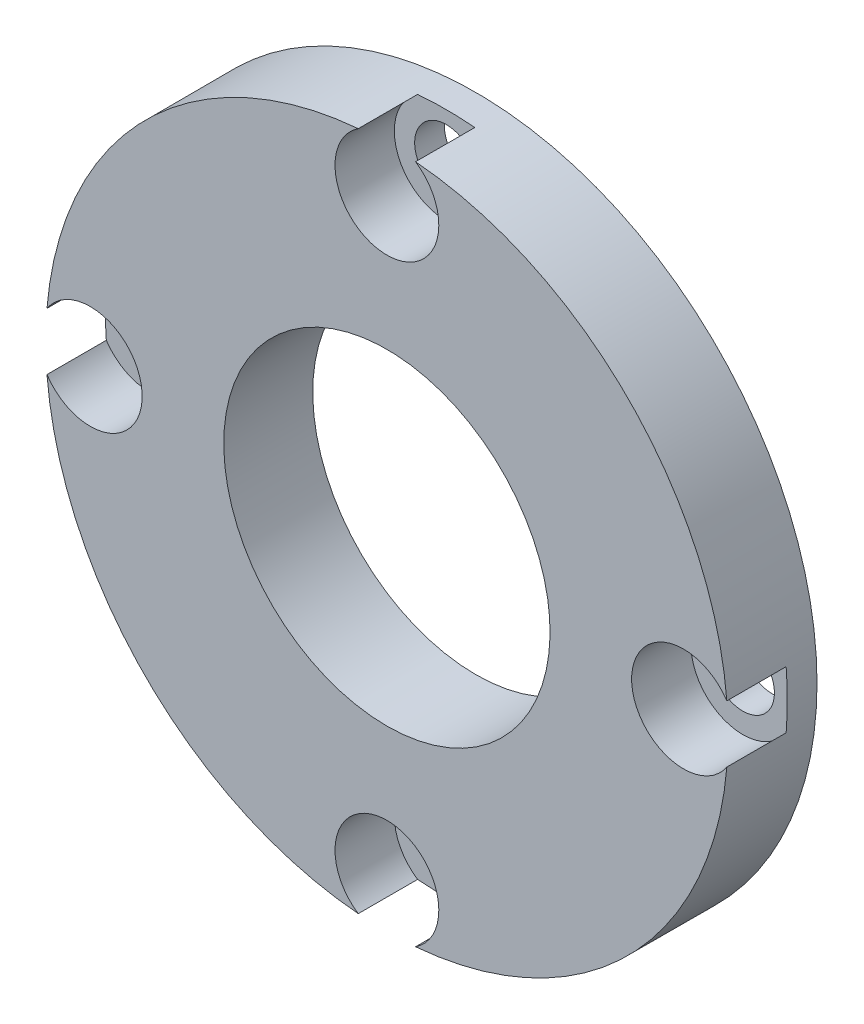
ISO-10303-21;
HEADER;
FILE_DESCRIPTION(('STEP AP214'),'2;1');
FILE_NAME('part.step','',(''),(''),'','','');
FILE_SCHEMA(('AUTOMOTIVE_DESIGN { 1 0 10303 214 1 1 1 1 }'));
ENDSEC;
DATA;
#1=APPLICATION_CONTEXT('core data for automotive mechanical design processes');
#2=APPLICATION_PROTOCOL_DEFINITION('international standard','automotive_design',2000,#1);
#3=PRODUCT_CONTEXT('',#1,'mechanical');
#4=PRODUCT('Part','Part','',(#3));
#5=PRODUCT_RELATED_PRODUCT_CATEGORY('part','',(#4));
#6=PRODUCT_DEFINITION_FORMATION('','',#4);
#7=PRODUCT_DEFINITION_CONTEXT('part definition',#1,'design');
#8=PRODUCT_DEFINITION('design','',#6,#7);
#9=PRODUCT_DEFINITION_SHAPE('','',#8);
#10=(LENGTH_UNIT() NAMED_UNIT(*) SI_UNIT(.MILLI.,.METRE.));
#11=(NAMED_UNIT(*) PLANE_ANGLE_UNIT() SI_UNIT($,.RADIAN.));
#12=(NAMED_UNIT(*) SI_UNIT($,.STERADIAN.) SOLID_ANGLE_UNIT());
#13=UNCERTAINTY_MEASURE_WITH_UNIT(LENGTH_MEASURE(1.E-05),#10,'distance_accuracy_value','');
#14=(GEOMETRIC_REPRESENTATION_CONTEXT(3) GLOBAL_UNCERTAINTY_ASSIGNED_CONTEXT((#13)) GLOBAL_UNIT_ASSIGNED_CONTEXT((#10,
#11,#12)) REPRESENTATION_CONTEXT('',''));
#15=CARTESIAN_POINT('',(0.,0.,0.));
#16=DIRECTION('',(0.,0.,1.));
#17=DIRECTION('',(1.,0.,0.));
#18=AXIS2_PLACEMENT_3D('',#15,#16,#17);
#19=CARTESIAN_POINT('',(0.,0.,9.525));
#20=DIRECTION('',(0.,0.,-1.));
#21=DIRECTION('',(-1.,0.,0.));
#22=AXIS2_PLACEMENT_3D('',#19,#20,#21);
#23=CYLINDRICAL_SURFACE('',#22,36.5125);
#24=CARTESIAN_POINT('',(0.,0.,3.175));
#25=DIRECTION('',(0.,0.,-1.));
#26=DIRECTION('',(-1.,0.,0.));
#27=AXIS2_PLACEMENT_3D('',#24,#25,#26);
#28=CIRCLE('',#27,36.5125);
#29=CARTESIAN_POINT('',(-3.06634098159039,36.383515625,3.175));
#30=VERTEX_POINT('',#29);
#31=CARTESIAN_POINT('',(3.06634098159039,36.383515625,3.175));
#32=VERTEX_POINT('',#31);
#33=EDGE_CURVE('E12',#30,#32,#28,.T.);
#34=ORIENTED_EDGE('',*,*,#33,.T.);
#35=DIRECTION('',(0.,0.,1.));
#36=VECTOR('',#35,1.);
#37=CARTESIAN_POINT('',(3.06634098159038,36.383515625,6.35));
#38=LINE('',#37,#36);
#39=CARTESIAN_POINT('',(3.06634098159038,36.383515625,9.525));
#40=VERTEX_POINT('',#39);
#41=EDGE_CURVE('E106',#32,#40,#38,.T.);
#42=ORIENTED_EDGE('',*,*,#41,.T.);
#43=CARTESIAN_POINT('',(0.,0.,9.525));
#44=DIRECTION('',(0.,0.,1.));
#45=DIRECTION('',(1.,0.,0.));
#46=AXIS2_PLACEMENT_3D('',#43,#44,#45);
#47=CIRCLE('',#46,36.5125);
#48=CARTESIAN_POINT('',(36.383515625,3.06634098159037,9.525));
#49=VERTEX_POINT('',#48);
#50=EDGE_CURVE('E268',#49,#40,#47,.T.);
#51=ORIENTED_EDGE('',*,*,#50,.F.);
#52=DIRECTION('',(0.,0.,1.));
#53=VECTOR('',#52,1.);
#54=CARTESIAN_POINT('',(36.383515625,3.06634098159038,6.35));
#55=LINE('',#54,#53);
#56=CARTESIAN_POINT('',(36.383515625,3.06634098159038,3.175));
#57=VERTEX_POINT('',#56);
#58=EDGE_CURVE('E199',#49,#57,#55,.F.);
#59=ORIENTED_EDGE('',*,*,#58,.T.);
#60=CARTESIAN_POINT('',(0.,0.,3.175));
#61=DIRECTION('',(0.,0.,-1.));
#62=DIRECTION('',(-1.,0.,0.));
#63=AXIS2_PLACEMENT_3D('',#60,#61,#62);
#64=CIRCLE('',#63,36.5125);
#65=CARTESIAN_POINT('',(36.383515625,-3.06634098159038,3.175));
#66=VERTEX_POINT('',#65);
#67=EDGE_CURVE('E297',#57,#66,#64,.T.);
#68=ORIENTED_EDGE('',*,*,#67,.T.);
#69=DIRECTION('',(0.,0.,1.));
#70=VECTOR('',#69,1.);
#71=CARTESIAN_POINT('',(36.383515625,-3.06634098159038,6.35));
#72=LINE('',#71,#70);
#73=CARTESIAN_POINT('',(36.383515625,-3.06634098159038,9.525));
#74=VERTEX_POINT('',#73);
#75=EDGE_CURVE('E205',#66,#74,#72,.T.);
#76=ORIENTED_EDGE('',*,*,#75,.T.);
#77=CARTESIAN_POINT('',(3.06634098159037,-36.383515625,9.525));
#78=VERTEX_POINT('',#77);
#79=EDGE_CURVE('E273',#78,#74,#47,.T.);
#80=ORIENTED_EDGE('',*,*,#79,.F.);
#81=DIRECTION('',(0.,0.,1.));
#82=VECTOR('',#81,1.);
#83=CARTESIAN_POINT('',(3.06634098159038,-36.383515625,6.35));
#84=LINE('',#83,#82);
#85=CARTESIAN_POINT('',(3.06634098159039,-36.383515625,3.175));
#86=VERTEX_POINT('',#85);
#87=EDGE_CURVE('E187',#78,#86,#84,.F.);
#88=ORIENTED_EDGE('',*,*,#87,.T.);
#89=CARTESIAN_POINT('',(0.,0.,3.175));
#90=DIRECTION('',(0.,0.,-1.));
#91=DIRECTION('',(-1.,0.,0.));
#92=AXIS2_PLACEMENT_3D('',#89,#90,#91);
#93=CIRCLE('',#92,36.5125);
#94=CARTESIAN_POINT('',(-3.06634098159039,-36.383515625,3.175));
#95=VERTEX_POINT('',#94);
#96=EDGE_CURVE('E292',#86,#95,#93,.T.);
#97=ORIENTED_EDGE('',*,*,#96,.T.);
#98=DIRECTION('',(0.,0.,1.));
#99=VECTOR('',#98,1.);
#100=CARTESIAN_POINT('',(-3.06634098159038,-36.383515625,6.35));
#101=LINE('',#100,#99);
#102=CARTESIAN_POINT('',(-3.06634098159038,-36.383515625,9.525));
#103=VERTEX_POINT('',#102);
#104=EDGE_CURVE('E282',#95,#103,#101,.T.);
#105=ORIENTED_EDGE('',*,*,#104,.T.);
#106=CARTESIAN_POINT('',(-36.383515625,-3.06634098159037,9.525));
#107=VERTEX_POINT('',#106);
#108=EDGE_CURVE('E266',#107,#103,#47,.T.);
#109=ORIENTED_EDGE('',*,*,#108,.F.);
#110=DIRECTION('',(0.,0.,1.));
#111=VECTOR('',#110,1.);
#112=CARTESIAN_POINT('',(-36.383515625,-3.06634098159038,6.35));
#113=LINE('',#112,#111);
#114=CARTESIAN_POINT('',(-36.383515625,-3.06634098159039,3.175));
#115=VERTEX_POINT('',#114);
#116=EDGE_CURVE('E63',#107,#115,#113,.F.);
#117=ORIENTED_EDGE('',*,*,#116,.T.);
#118=CARTESIAN_POINT('',(0.,0.,3.175));
#119=DIRECTION('',(0.,0.,-1.));
#120=DIRECTION('',(-1.,0.,0.));
#121=AXIS2_PLACEMENT_3D('',#118,#119,#120);
#122=CIRCLE('',#121,36.5125);
#123=CARTESIAN_POINT('',(-36.383515625,3.06634098159038,3.175));
#124=VERTEX_POINT('',#123);
#125=EDGE_CURVE('E301',#115,#124,#122,.T.);
#126=ORIENTED_EDGE('',*,*,#125,.T.);
#127=DIRECTION('',(0.,0.,1.));
#128=VECTOR('',#127,1.);
#129=CARTESIAN_POINT('',(-36.383515625,3.06634098159038,6.35));
#130=LINE('',#129,#128);
#131=CARTESIAN_POINT('',(-36.383515625,3.06634098159038,9.525));
#132=VERTEX_POINT('',#131);
#133=EDGE_CURVE('E300',#124,#132,#130,.T.);
#134=ORIENTED_EDGE('',*,*,#133,.T.);
#135=CARTESIAN_POINT('',(-3.06634098159037,36.383515625,9.525));
#136=VERTEX_POINT('',#135);
#137=EDGE_CURVE('E122',#136,#132,#47,.T.);
#138=ORIENTED_EDGE('',*,*,#137,.F.);
#139=DIRECTION('',(0.,0.,1.));
#140=VECTOR('',#139,1.);
#141=CARTESIAN_POINT('',(-3.06634098159038,36.383515625,6.35));
#142=LINE('',#141,#140);
#143=EDGE_CURVE('E55',#136,#30,#142,.F.);
#144=ORIENTED_EDGE('',*,*,#143,.T.);
#145=EDGE_LOOP('',(#34,#42,#51,#59,#68,#76,#80,#88,#97,#105,#109,#117,#126,#134,#138,#144));
#146=FACE_BOUND('',#145,.T.);
#147=CARTESIAN_POINT('',(0.,0.,0.));
#148=DIRECTION('',(0.,0.,1.));
#149=DIRECTION('',(1.,0.,0.));
#150=AXIS2_PLACEMENT_3D('',#147,#148,#149);
#151=CIRCLE('',#150,36.5125);
#152=CARTESIAN_POINT('',(36.5125,0.,0.));
#153=VERTEX_POINT('',#152);
#154=EDGE_CURVE('E265',#153,#153,#151,.T.);
#155=ORIENTED_EDGE('',*,*,#154,.T.);
#156=EDGE_LOOP('',(#155));
#157=FACE_BOUND('',#156,.T.);
#158=ADVANCED_FACE('F41',(#146,#157),#23,.T.);
#159=CARTESIAN_POINT('',(0.,0.,9.525));
#160=DIRECTION('',(0.,0.,1.));
#161=DIRECTION('',(1.,0.,0.));
#162=AXIS2_PLACEMENT_3D('',#159,#160,#161);
#163=PLANE('',#162);
#164=CARTESIAN_POINT('',(0.,31.75,9.525));
#165=DIRECTION('',(0.,0.,1.));
#166=DIRECTION('',(1.,0.,0.));
#167=AXIS2_PLACEMENT_3D('',#164,#165,#166);
#168=CIRCLE('',#167,5.55625);
#169=EDGE_CURVE('E48',#136,#40,#168,.T.);
#170=ORIENTED_EDGE('',*,*,#169,.F.);
#171=ORIENTED_EDGE('',*,*,#137,.T.);
#172=CARTESIAN_POINT('',(-31.75,0.,9.525));
#173=DIRECTION('',(0.,0.,1.));
#174=DIRECTION('',(1.,0.,0.));
#175=AXIS2_PLACEMENT_3D('',#172,#173,#174);
#176=CIRCLE('',#175,5.55625);
#177=EDGE_CURVE('E298',#107,#132,#176,.T.);
#178=ORIENTED_EDGE('',*,*,#177,.F.);
#179=ORIENTED_EDGE('',*,*,#108,.T.);
#180=CARTESIAN_POINT('',(0.,-31.75,9.525));
#181=DIRECTION('',(0.,0.,1.));
#182=DIRECTION('',(1.,0.,0.));
#183=AXIS2_PLACEMENT_3D('',#180,#181,#182);
#184=CIRCLE('',#183,5.55625);
#185=EDGE_CURVE('E275',#78,#103,#184,.T.);
#186=ORIENTED_EDGE('',*,*,#185,.F.);
#187=ORIENTED_EDGE('',*,*,#79,.T.);
#188=CARTESIAN_POINT('',(31.75,0.,9.525));
#189=DIRECTION('',(0.,0.,1.));
#190=DIRECTION('',(1.,0.,0.));
#191=AXIS2_PLACEMENT_3D('',#188,#189,#190);
#192=CIRCLE('',#191,5.55625);
#193=EDGE_CURVE('E175',#49,#74,#192,.T.);
#194=ORIENTED_EDGE('',*,*,#193,.F.);
#195=ORIENTED_EDGE('',*,*,#50,.T.);
#196=EDGE_LOOP('',(#170,#171,#178,#179,#186,#187,#194,#195));
#197=FACE_BOUND('',#196,.T.);
#198=CARTESIAN_POINT('',(0.,0.,9.525));
#199=DIRECTION('',(0.,0.,1.));
#200=DIRECTION('',(0.,-1.,0.));
#201=AXIS2_PLACEMENT_3D('',#198,#199,#200);
#202=CIRCLE('',#201,17.4625);
#203=CARTESIAN_POINT('',(0.,-17.4625,9.525));
#204=VERTEX_POINT('',#203);
#205=EDGE_CURVE('E269',#204,#204,#202,.T.);
#206=ORIENTED_EDGE('',*,*,#205,.F.);
#207=EDGE_LOOP('',(#206));
#208=FACE_BOUND('',#207,.T.);
#209=ADVANCED_FACE('F236',(#197,#208),#163,.T.);
#210=CARTESIAN_POINT('',(0.,0.,0.));
#211=DIRECTION('',(0.,0.,1.));
#212=DIRECTION('',(1.,0.,0.));
#213=AXIS2_PLACEMENT_3D('',#210,#211,#212);
#214=PLANE('',#213);
#215=CARTESIAN_POINT('',(0.,31.75,0.));
#216=DIRECTION('',(0.,0.,1.));
#217=DIRECTION('',(1.,0.,0.));
#218=AXIS2_PLACEMENT_3D('',#215,#216,#217);
#219=CIRCLE('',#218,3.3782);
#220=CARTESIAN_POINT('',(3.3782,31.75,0.));
#221=VERTEX_POINT('',#220);
#222=EDGE_CURVE('E123',#221,#221,#219,.T.);
#223=ORIENTED_EDGE('',*,*,#222,.T.);
#224=EDGE_LOOP('',(#223));
#225=FACE_BOUND('',#224,.T.);
#226=CARTESIAN_POINT('',(-31.75,0.,0.));
#227=DIRECTION('',(0.,0.,1.));
#228=DIRECTION('',(1.,0.,0.));
#229=AXIS2_PLACEMENT_3D('',#226,#227,#228);
#230=CIRCLE('',#229,3.3782);
#231=CARTESIAN_POINT('',(-28.3718,0.,0.));
#232=VERTEX_POINT('',#231);
#233=EDGE_CURVE('E148',#232,#232,#230,.T.);
#234=ORIENTED_EDGE('',*,*,#233,.T.);
#235=EDGE_LOOP('',(#234));
#236=FACE_BOUND('',#235,.T.);
#237=CARTESIAN_POINT('',(31.75,0.,0.));
#238=DIRECTION('',(0.,0.,1.));
#239=DIRECTION('',(1.,0.,0.));
#240=AXIS2_PLACEMENT_3D('',#237,#238,#239);
#241=CIRCLE('',#240,3.3782);
#242=CARTESIAN_POINT('',(35.1282,0.,0.));
#243=VERTEX_POINT('',#242);
#244=EDGE_CURVE('E195',#243,#243,#241,.T.);
#245=ORIENTED_EDGE('',*,*,#244,.T.);
#246=EDGE_LOOP('',(#245));
#247=FACE_BOUND('',#246,.T.);
#248=CARTESIAN_POINT('',(0.,-31.75,0.));
#249=DIRECTION('',(0.,0.,1.));
#250=DIRECTION('',(1.,0.,0.));
#251=AXIS2_PLACEMENT_3D('',#248,#249,#250);
#252=CIRCLE('',#251,3.3782);
#253=CARTESIAN_POINT('',(3.3782,-31.75,0.));
#254=VERTEX_POINT('',#253);
#255=EDGE_CURVE('E182',#254,#254,#252,.T.);
#256=ORIENTED_EDGE('',*,*,#255,.T.);
#257=EDGE_LOOP('',(#256));
#258=FACE_BOUND('',#257,.T.);
#259=CARTESIAN_POINT('',(0.,0.,0.));
#260=DIRECTION('',(0.,0.,1.));
#261=DIRECTION('',(0.,-1.,0.));
#262=AXIS2_PLACEMENT_3D('',#259,#260,#261);
#263=CIRCLE('',#262,17.4625);
#264=CARTESIAN_POINT('',(0.,-17.4625,0.));
#265=VERTEX_POINT('',#264);
#266=EDGE_CURVE('E262',#265,#265,#263,.T.);
#267=ORIENTED_EDGE('',*,*,#266,.T.);
#268=EDGE_LOOP('',(#267));
#269=FACE_BOUND('',#268,.T.);
#270=ORIENTED_EDGE('',*,*,#154,.F.);
#271=EDGE_LOOP('',(#270));
#272=FACE_BOUND('',#271,.T.);
#273=ADVANCED_FACE('F231',(#225,#236,#247,#258,#269,#272),#214,.F.);
#274=CARTESIAN_POINT('',(0.,0.,0.));
#275=DIRECTION('',(0.,0.,1.));
#276=DIRECTION('',(0.,-1.,0.));
#277=AXIS2_PLACEMENT_3D('',#274,#275,#276);
#278=CYLINDRICAL_SURFACE('',#277,17.4625);
#279=ORIENTED_EDGE('',*,*,#266,.F.);
#280=EDGE_LOOP('',(#279));
#281=FACE_BOUND('',#280,.T.);
#282=ORIENTED_EDGE('',*,*,#205,.T.);
#283=EDGE_LOOP('',(#282));
#284=FACE_BOUND('',#283,.T.);
#285=ADVANCED_FACE('F223',(#281,#284),#278,.F.);
#286=CARTESIAN_POINT('',(3.3782,-31.75,3.175));
#287=DIRECTION('',(0.,0.,-1.));
#288=DIRECTION('',(-1.,0.,0.));
#289=AXIS2_PLACEMENT_3D('',#286,#287,#288);
#290=PLANE('',#289);
#291=CARTESIAN_POINT('',(0.,-31.75,3.175));
#292=DIRECTION('',(0.,0.,1.));
#293=DIRECTION('',(1.,0.,0.));
#294=AXIS2_PLACEMENT_3D('',#291,#292,#293);
#295=CIRCLE('',#294,3.3782);
#296=CARTESIAN_POINT('',(3.3782,-31.75,3.175));
#297=VERTEX_POINT('',#296);
#298=EDGE_CURVE('E188',#297,#297,#295,.T.);
#299=ORIENTED_EDGE('',*,*,#298,.F.);
#300=EDGE_LOOP('',(#299));
#301=FACE_BOUND('',#300,.T.);
#302=CARTESIAN_POINT('',(0.,-31.75,3.175));
#303=DIRECTION('',(0.,0.,1.));
#304=DIRECTION('',(1.,0.,0.));
#305=AXIS2_PLACEMENT_3D('',#302,#303,#304);
#306=CIRCLE('',#305,5.55625);
#307=EDGE_CURVE('E207',#86,#95,#306,.T.);
#308=ORIENTED_EDGE('',*,*,#307,.T.);
#309=ORIENTED_EDGE('',*,*,#96,.F.);
#310=EDGE_LOOP('',(#308,#309));
#311=FACE_BOUND('',#310,.T.);
#312=ADVANCED_FACE('F220',(#301,#311),#290,.F.);
#313=CARTESIAN_POINT('',(0.,-31.75,9.525));
#314=DIRECTION('',(0.,0.,1.));
#315=DIRECTION('',(1.,0.,0.));
#316=AXIS2_PLACEMENT_3D('',#313,#314,#315);
#317=CYLINDRICAL_SURFACE('',#316,5.55625);
#318=ORIENTED_EDGE('',*,*,#307,.F.);
#319=ORIENTED_EDGE('',*,*,#87,.F.);
#320=ORIENTED_EDGE('',*,*,#185,.T.);
#321=ORIENTED_EDGE('',*,*,#104,.F.);
#322=EDGE_LOOP('',(#318,#319,#320,#321));
#323=FACE_BOUND('',#322,.T.);
#324=ADVANCED_FACE('F222',(#323),#317,.F.);
#325=CARTESIAN_POINT('',(0.,-31.75,9.525));
#326=DIRECTION('',(0.,0.,1.));
#327=DIRECTION('',(1.,0.,0.));
#328=AXIS2_PLACEMENT_3D('',#325,#326,#327);
#329=CYLINDRICAL_SURFACE('',#328,3.3782);
#330=ORIENTED_EDGE('',*,*,#255,.F.);
#331=EDGE_LOOP('',(#330));
#332=FACE_BOUND('',#331,.T.);
#333=ORIENTED_EDGE('',*,*,#298,.T.);
#334=EDGE_LOOP('',(#333));
#335=FACE_BOUND('',#334,.T.);
#336=ADVANCED_FACE('F218',(#332,#335),#329,.F.);
#337=CARTESIAN_POINT('',(35.1282,0.,3.175));
#338=DIRECTION('',(0.,0.,-1.));
#339=DIRECTION('',(-1.,0.,0.));
#340=AXIS2_PLACEMENT_3D('',#337,#338,#339);
#341=PLANE('',#340);
#342=CARTESIAN_POINT('',(31.75,0.,3.175));
#343=DIRECTION('',(0.,0.,1.));
#344=DIRECTION('',(1.,0.,0.));
#345=AXIS2_PLACEMENT_3D('',#342,#343,#344);
#346=CIRCLE('',#345,3.3782);
#347=CARTESIAN_POINT('',(35.1282,0.,3.175));
#348=VERTEX_POINT('',#347);
#349=EDGE_CURVE('E174',#348,#348,#346,.T.);
#350=ORIENTED_EDGE('',*,*,#349,.F.);
#351=EDGE_LOOP('',(#350));
#352=FACE_BOUND('',#351,.T.);
#353=CARTESIAN_POINT('',(31.75,0.,3.175));
#354=DIRECTION('',(0.,0.,1.));
#355=DIRECTION('',(1.,0.,0.));
#356=AXIS2_PLACEMENT_3D('',#353,#354,#355);
#357=CIRCLE('',#356,5.55625);
#358=EDGE_CURVE('E169',#57,#66,#357,.T.);
#359=ORIENTED_EDGE('',*,*,#358,.T.);
#360=ORIENTED_EDGE('',*,*,#67,.F.);
#361=EDGE_LOOP('',(#359,#360));
#362=FACE_BOUND('',#361,.T.);
#363=ADVANCED_FACE('F248',(#352,#362),#341,.F.);
#364=CARTESIAN_POINT('',(31.75,0.,9.525));
#365=DIRECTION('',(0.,0.,1.));
#366=DIRECTION('',(1.,0.,0.));
#367=AXIS2_PLACEMENT_3D('',#364,#365,#366);
#368=CYLINDRICAL_SURFACE('',#367,5.55625);
#369=ORIENTED_EDGE('',*,*,#358,.F.);
#370=ORIENTED_EDGE('',*,*,#58,.F.);
#371=ORIENTED_EDGE('',*,*,#193,.T.);
#372=ORIENTED_EDGE('',*,*,#75,.F.);
#373=EDGE_LOOP('',(#369,#370,#371,#372));
#374=FACE_BOUND('',#373,.T.);
#375=ADVANCED_FACE('F253',(#374),#368,.F.);
#376=CARTESIAN_POINT('',(31.75,0.,9.525));
#377=DIRECTION('',(0.,0.,1.));
#378=DIRECTION('',(1.,0.,0.));
#379=AXIS2_PLACEMENT_3D('',#376,#377,#378);
#380=CYLINDRICAL_SURFACE('',#379,3.3782);
#381=ORIENTED_EDGE('',*,*,#244,.F.);
#382=EDGE_LOOP('',(#381));
#383=FACE_BOUND('',#382,.T.);
#384=ORIENTED_EDGE('',*,*,#349,.T.);
#385=EDGE_LOOP('',(#384));
#386=FACE_BOUND('',#385,.T.);
#387=ADVANCED_FACE('F311',(#383,#386),#380,.F.);
#388=CARTESIAN_POINT('',(-28.3718,0.,3.175));
#389=DIRECTION('',(0.,0.,-1.));
#390=DIRECTION('',(-1.,0.,0.));
#391=AXIS2_PLACEMENT_3D('',#388,#389,#390);
#392=PLANE('',#391);
#393=CARTESIAN_POINT('',(-31.75,0.,3.175));
#394=DIRECTION('',(0.,0.,1.));
#395=DIRECTION('',(1.,0.,0.));
#396=AXIS2_PLACEMENT_3D('',#393,#394,#395);
#397=CIRCLE('',#396,3.3782);
#398=CARTESIAN_POINT('',(-28.3718,0.,3.175));
#399=VERTEX_POINT('',#398);
#400=EDGE_CURVE('E133',#399,#399,#397,.T.);
#401=ORIENTED_EDGE('',*,*,#400,.F.);
#402=EDGE_LOOP('',(#401));
#403=FACE_BOUND('',#402,.T.);
#404=CARTESIAN_POINT('',(-31.75,0.,3.175));
#405=DIRECTION('',(0.,0.,1.));
#406=DIRECTION('',(1.,0.,0.));
#407=AXIS2_PLACEMENT_3D('',#404,#405,#406);
#408=CIRCLE('',#407,5.55625);
#409=EDGE_CURVE('E113',#115,#124,#408,.T.);
#410=ORIENTED_EDGE('',*,*,#409,.T.);
#411=ORIENTED_EDGE('',*,*,#125,.F.);
#412=EDGE_LOOP('',(#410,#411));
#413=FACE_BOUND('',#412,.T.);
#414=ADVANCED_FACE('F316',(#403,#413),#392,.F.);
#415=CARTESIAN_POINT('',(-31.75,0.,9.525));
#416=DIRECTION('',(0.,0.,1.));
#417=DIRECTION('',(1.,0.,0.));
#418=AXIS2_PLACEMENT_3D('',#415,#416,#417);
#419=CYLINDRICAL_SURFACE('',#418,5.55625);
#420=ORIENTED_EDGE('',*,*,#409,.F.);
#421=ORIENTED_EDGE('',*,*,#116,.F.);
#422=ORIENTED_EDGE('',*,*,#177,.T.);
#423=ORIENTED_EDGE('',*,*,#133,.F.);
#424=EDGE_LOOP('',(#420,#421,#422,#423));
#425=FACE_BOUND('',#424,.T.);
#426=ADVANCED_FACE('F299',(#425),#419,.F.);
#427=CARTESIAN_POINT('',(-31.75,0.,9.525));
#428=DIRECTION('',(0.,0.,1.));
#429=DIRECTION('',(1.,0.,0.));
#430=AXIS2_PLACEMENT_3D('',#427,#428,#429);
#431=CYLINDRICAL_SURFACE('',#430,3.3782);
#432=ORIENTED_EDGE('',*,*,#233,.F.);
#433=EDGE_LOOP('',(#432));
#434=FACE_BOUND('',#433,.T.);
#435=ORIENTED_EDGE('',*,*,#400,.T.);
#436=EDGE_LOOP('',(#435));
#437=FACE_BOUND('',#436,.T.);
#438=ADVANCED_FACE('F320',(#434,#437),#431,.F.);
#439=CARTESIAN_POINT('',(3.3782,31.75,3.175));
#440=DIRECTION('',(0.,0.,-1.));
#441=DIRECTION('',(-1.,0.,0.));
#442=AXIS2_PLACEMENT_3D('',#439,#440,#441);
#443=PLANE('',#442);
#444=CARTESIAN_POINT('',(0.,31.75,3.175));
#445=DIRECTION('',(0.,0.,1.));
#446=DIRECTION('',(1.,0.,0.));
#447=AXIS2_PLACEMENT_3D('',#444,#445,#446);
#448=CIRCLE('',#447,3.3782);
#449=CARTESIAN_POINT('',(3.3782,31.75,3.175));
#450=VERTEX_POINT('',#449);
#451=EDGE_CURVE('E117',#450,#450,#448,.T.);
#452=ORIENTED_EDGE('',*,*,#451,.F.);
#453=EDGE_LOOP('',(#452));
#454=FACE_BOUND('',#453,.T.);
#455=CARTESIAN_POINT('',(0.,31.75,3.175));
#456=DIRECTION('',(0.,0.,1.));
#457=DIRECTION('',(1.,0.,0.));
#458=AXIS2_PLACEMENT_3D('',#455,#456,#457);
#459=CIRCLE('',#458,5.55625);
#460=EDGE_CURVE('E109',#30,#32,#459,.T.);
#461=ORIENTED_EDGE('',*,*,#460,.T.);
#462=ORIENTED_EDGE('',*,*,#33,.F.);
#463=EDGE_LOOP('',(#461,#462));
#464=FACE_BOUND('',#463,.T.);
#465=ADVANCED_FACE('F116',(#454,#464),#443,.F.);
#466=CARTESIAN_POINT('',(0.,31.75,9.525));
#467=DIRECTION('',(0.,0.,1.));
#468=DIRECTION('',(1.,0.,0.));
#469=AXIS2_PLACEMENT_3D('',#466,#467,#468);
#470=CYLINDRICAL_SURFACE('',#469,5.55625);
#471=ORIENTED_EDGE('',*,*,#460,.F.);
#472=ORIENTED_EDGE('',*,*,#143,.F.);
#473=ORIENTED_EDGE('',*,*,#169,.T.);
#474=ORIENTED_EDGE('',*,*,#41,.F.);
#475=EDGE_LOOP('',(#471,#472,#473,#474));
#476=FACE_BOUND('',#475,.T.);
#477=ADVANCED_FACE('F108',(#476),#470,.F.);
#478=CARTESIAN_POINT('',(0.,31.75,9.525));
#479=DIRECTION('',(0.,0.,1.));
#480=DIRECTION('',(1.,0.,0.));
#481=AXIS2_PLACEMENT_3D('',#478,#479,#480);
#482=CYLINDRICAL_SURFACE('',#481,3.3782);
#483=ORIENTED_EDGE('',*,*,#222,.F.);
#484=EDGE_LOOP('',(#483));
#485=FACE_BOUND('',#484,.T.);
#486=ORIENTED_EDGE('',*,*,#451,.T.);
#487=EDGE_LOOP('',(#486));
#488=FACE_BOUND('',#487,.T.);
#489=ADVANCED_FACE('F329',(#485,#488),#482,.F.);
#490=CLOSED_SHELL('',(#158,#209,#273,#285,#312,#324,#336,#363,#375,#387,#414,#426,#438,#465,
#477,#489));
#491=MANIFOLD_SOLID_BREP('B2',#490);
#492=ADVANCED_BREP_SHAPE_REPRESENTATION('',(#18,#491),#14);
#493=SHAPE_DEFINITION_REPRESENTATION(#9,#492);
ENDSEC;
END-ISO-10303-21;
